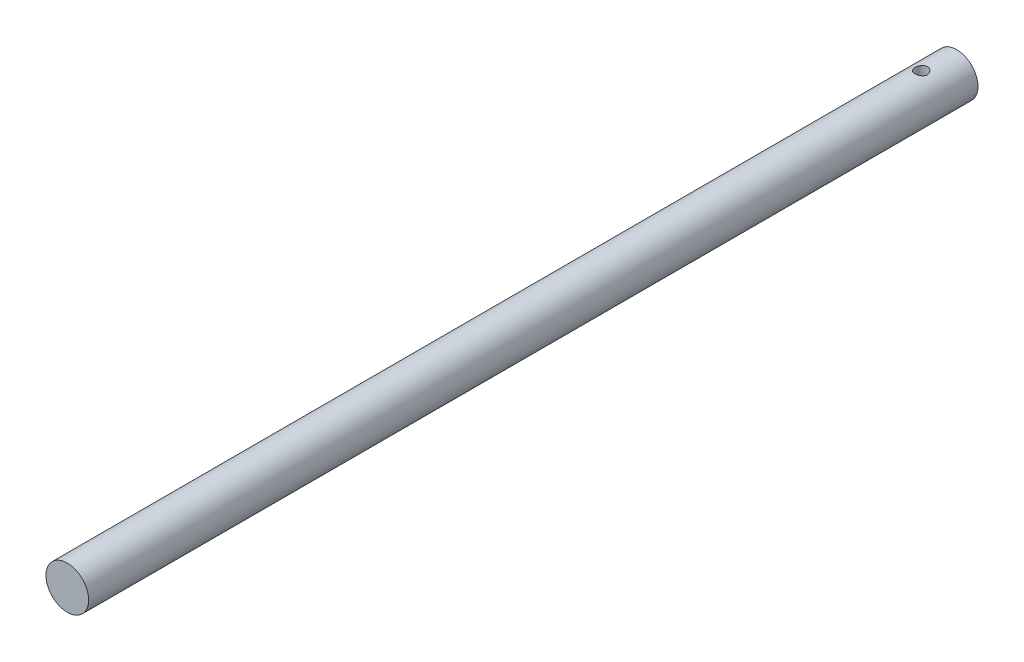
ISO-10303-21;
HEADER;
FILE_DESCRIPTION(('STEP AP214'),'2;1');
FILE_NAME('part.step','',(''),(''),'','','');
FILE_SCHEMA(('AUTOMOTIVE_DESIGN { 1 0 10303 214 1 1 1 1 }'));
ENDSEC;
DATA;
#1=APPLICATION_CONTEXT('core data for automotive mechanical design processes');
#2=APPLICATION_PROTOCOL_DEFINITION('international standard','automotive_design',2000,#1);
#3=PRODUCT_CONTEXT('',#1,'mechanical');
#4=PRODUCT('Part','Part','',(#3));
#5=PRODUCT_RELATED_PRODUCT_CATEGORY('part','',(#4));
#6=PRODUCT_DEFINITION_FORMATION('','',#4);
#7=PRODUCT_DEFINITION_CONTEXT('part definition',#1,'design');
#8=PRODUCT_DEFINITION('design','',#6,#7);
#9=PRODUCT_DEFINITION_SHAPE('','',#8);
#10=(LENGTH_UNIT() NAMED_UNIT(*) SI_UNIT(.MILLI.,.METRE.));
#11=(NAMED_UNIT(*) PLANE_ANGLE_UNIT() SI_UNIT($,.RADIAN.));
#12=(NAMED_UNIT(*) SI_UNIT($,.STERADIAN.) SOLID_ANGLE_UNIT());
#13=UNCERTAINTY_MEASURE_WITH_UNIT(LENGTH_MEASURE(1.E-05),#10,'distance_accuracy_value','');
#14=(GEOMETRIC_REPRESENTATION_CONTEXT(3) GLOBAL_UNCERTAINTY_ASSIGNED_CONTEXT((#13)) GLOBAL_UNIT_ASSIGNED_CONTEXT((#10,
#11,#12)) REPRESENTATION_CONTEXT('',''));
#15=CARTESIAN_POINT('',(0.,0.,0.));
#16=DIRECTION('',(0.,0.,1.));
#17=DIRECTION('',(1.,0.,0.));
#18=AXIS2_PLACEMENT_3D('',#15,#16,#17);
#19=CARTESIAN_POINT('',(0.,0.,250.));
#20=DIRECTION('',(0.,0.,-1.));
#21=DIRECTION('',(-1.,0.,0.));
#22=AXIS2_PLACEMENT_3D('',#19,#20,#21);
#23=CYLINDRICAL_SURFACE('',#22,6.);
#24=CARTESIAN_POINT('',(0.,-6.,11.75));
#25=CARTESIAN_POINT('',(0.0961253080181366,-5.99999897932778,11.749998515148));
#26=CARTESIAN_POINT('',(0.192265738977877,-5.99766772555916,11.7420535900183));
#27=CARTESIAN_POINT('',(0.381754666118447,-5.9885952693758,11.7105542039317));
#28=CARTESIAN_POINT('',(0.475102186570467,-5.98185254415878,11.6869943527991));
#29=CARTESIAN_POINT('',(0.656244329270385,-5.96469737869574,11.6251129938174));
#30=CARTESIAN_POINT('',(0.744046672462426,-5.95429017982355,11.5868125624894));
#31=CARTESIAN_POINT('',(0.911982923632399,-5.93089244308038,11.4966215584001));
#32=CARTESIAN_POINT('',(0.992115936834369,-5.91790160432062,11.4447294025335));
#33=CARTESIAN_POINT('',(1.14462561886912,-5.89033024399658,11.327334984187));
#34=CARTESIAN_POINT('',(1.2167633564312,-5.87571850769828,11.2615296641669));
#35=CARTESIAN_POINT('',(1.34915166645239,-5.84674198910841,11.1188232710068));
#36=CARTESIAN_POINT('',(1.40940036887666,-5.83237724599043,11.0419204556219));
#37=CARTESIAN_POINT('',(1.51753336674038,-5.80519383512121,10.8772103328606));
#38=CARTESIAN_POINT('',(1.56513041604445,-5.79241411758615,10.7892074182337));
#39=CARTESIAN_POINT('',(1.64475391362964,-5.7703123169837,10.6060139235983));
#40=CARTESIAN_POINT('',(1.67678387060039,-5.76098945488303,10.5108249688552));
#41=CARTESIAN_POINT('',(1.72351063083406,-5.74718144308774,10.3186353702977));
#42=CARTESIAN_POINT('',(1.73864609017391,-5.74257413524905,10.2217503825351));
#43=CARTESIAN_POINT('',(1.75252346344242,-5.73835505823415,10.0267152085859));
#44=CARTESIAN_POINT('',(1.75126910635539,-5.73874215273942,9.92856531526511));
#45=CARTESIAN_POINT('',(1.73274795276527,-5.74435959682319,9.73731524540825));
#46=CARTESIAN_POINT('',(1.7160256839307,-5.74942523520474,9.64415670470324));
#47=CARTESIAN_POINT('',(1.66792117497863,-5.76356324195848,9.46202918903925));
#48=CARTESIAN_POINT('',(1.63653755962284,-5.77263598619394,9.37306060796158));
#49=CARTESIAN_POINT('',(1.55958925270797,-5.79390080921967,9.20048400801911));
#50=CARTESIAN_POINT('',(1.51384428393234,-5.80613217077637,9.116961417586));
#51=CARTESIAN_POINT('',(1.40959719774949,-5.83231660479806,8.95859323240331));
#52=CARTESIAN_POINT('',(1.35109213587038,-5.84627007432716,8.8837496465045));
#53=CARTESIAN_POINT('',(1.22026040657199,-5.87499914138168,8.74176939696963));
#54=CARTESIAN_POINT('',(1.14748039837389,-5.88978548224527,8.67505196568478));
#55=CARTESIAN_POINT('',(0.991581308885601,-5.91802612754819,8.55467457984276));
#56=CARTESIAN_POINT('',(0.908461646345307,-5.93148035702561,8.50101535986281));
#57=CARTESIAN_POINT('',(0.733510271908773,-5.955652534232,8.40804165565273));
#58=CARTESIAN_POINT('',(0.641629012196375,-5.96635347926388,8.36881569218869));
#59=CARTESIAN_POINT('',(0.452189927913562,-5.98369087780733,8.30649482914881));
#60=CARTESIAN_POINT('',(0.354633604003036,-5.99032840050988,8.28339568596673));
#61=CARTESIAN_POINT('',(0.160181198028381,-5.99862388766847,8.25467172956898));
#62=CARTESIAN_POINT('',(0.0633758944645891,-6.00044382600874,8.24847829102018));
#63=CARTESIAN_POINT('',(-0.129894955210872,-5.99937180655025,8.25215387818972));
#64=CARTESIAN_POINT('',(-0.226360542441064,-5.99648044012062,8.26202088797948));
#65=CARTESIAN_POINT('',(-0.414097830664111,-5.98641640064662,8.29707558682437));
#66=CARTESIAN_POINT('',(-0.505436223327995,-5.97933553979801,8.32193493989793));
#67=CARTESIAN_POINT('',(-0.682629103921199,-5.96170716095043,8.38587721933104));
#68=CARTESIAN_POINT('',(-0.768482945307057,-5.95115923513568,8.42496181900248));
#69=CARTESIAN_POINT('',(-0.934392573124851,-5.92740206937566,8.51722533792297));
#70=CARTESIAN_POINT('',(-1.01427661269997,-5.91413878305625,8.57069881094937));
#71=CARTESIAN_POINT('',(-1.16413296084878,-5.8864769523799,8.68986114921517));
#72=CARTESIAN_POINT('',(-1.23410291257553,-5.87207813933966,8.75555291051717));
#73=CARTESIAN_POINT('',(-1.36462158583737,-5.84315282434342,8.8999553503897));
#74=CARTESIAN_POINT('',(-1.42476642228299,-5.82863878716344,8.97903434380822));
#75=CARTESIAN_POINT('',(-1.5309555158763,-5.80165389300297,9.14647697273483));
#76=CARTESIAN_POINT('',(-1.57700021873977,-5.78918297144387,9.23484031463907));
#77=CARTESIAN_POINT('',(-1.65335355571835,-5.76784149110914,9.41800906834096));
#78=CARTESIAN_POINT('',(-1.68374186549711,-5.75895275395434,9.51277902915982));
#79=CARTESIAN_POINT('',(-1.72804822085091,-5.74581531845761,9.70639550313222));
#80=CARTESIAN_POINT('',(-1.74197152209896,-5.7415651395094,9.8052407050269));
#81=CARTESIAN_POINT('',(-1.75260895170656,-5.73832630544296,10.0000225411818));
#82=CARTESIAN_POINT('',(-1.74997891215048,-5.73913712613566,10.0959205098643));
#83=CARTESIAN_POINT('',(-1.72913831847244,-5.74545008197209,10.285842892854));
#84=CARTESIAN_POINT('',(-1.71092832593949,-5.75095204802057,10.3798673745672));
#85=CARTESIAN_POINT('',(-1.65985748033916,-5.76589662443703,10.5623661830132));
#86=CARTESIAN_POINT('',(-1.62716125079618,-5.77529488178541,10.6508904754052));
#87=CARTESIAN_POINT('',(-1.54817363617336,-5.79696714255007,10.8212672461219));
#88=CARTESIAN_POINT('',(-1.50187976224371,-5.80924167234268,10.9031184995373));
#89=CARTESIAN_POINT('',(-1.39513128146528,-5.83581435741765,11.0608920702377));
#90=CARTESIAN_POINT('',(-1.33424162455882,-5.85016789019055,11.1365107175418));
#91=CARTESIAN_POINT('',(-1.20082452655383,-5.87900256664697,11.276669675805));
#92=CARTESIAN_POINT('',(-1.12829412203371,-5.89348374193531,11.3412071571145));
#93=CARTESIAN_POINT('',(-0.97128517460281,-5.92141239923087,11.4591095314771));
#94=CARTESIAN_POINT('',(-0.886536063614253,-5.93482122382387,11.51212417615));
#95=CARTESIAN_POINT('',(-0.708936452074231,-5.95864200095583,11.6030752495548));
#96=CARTESIAN_POINT('',(-0.61609014933606,-5.96905549446415,11.6410194352315));
#97=CARTESIAN_POINT('',(-0.436605177870391,-5.98468728404806,11.6969409493079));
#98=CARTESIAN_POINT('',(-0.350586197050688,-5.99038360588642,11.7167862705583));
#99=CARTESIAN_POINT('',(-0.176382174555845,-5.99804015775584,11.7433155106133));
#100=CARTESIAN_POINT('',(-0.0881974529296931,-6.00000093649312,11.7500013623901));
#101=CARTESIAN_POINT('',(0.,-6.,11.75));
#102=B_SPLINE_CURVE_WITH_KNOTS('',3,(#24,#25,#26,#27,#28,#29,#30,#31,#32,#33,#34,#35,#36,#37,
#38,#39,#40,#41,#42,#43,#44,#45,#46,#47,#48,#49,#50,#51,#52,#53,#54,#55,#56,#57,#58,#59,#60,#61,
#62,#63,#64,#65,#66,#67,#68,#69,#70,#71,#72,#73,#74,#75,#76,#77,#78,#79,#80,#81,#82,#83,#84,#85,
#86,#87,#88,#89,#90,#91,#92,#93,#94,#95,#96,#97,#98,#99,#100,#101),.UNSPECIFIED.,.T.,.F.,(4,2,2,
2,2,2,2,2,2,2,2,2,2,2,2,2,2,2,2,2,2,2,2,2,2,2,2,2,2,2,2,2,2,2,2,2,2,2,4),(0.,0.288052093618848,
0.576203672859809,0.863944765925737,1.15171938874705,1.4465642107671,1.74145537223886,
2.04255951405361,2.34359575805744,2.63661948180926,2.92957653844227,3.21259753810652,
3.49564509054993,3.78239825352144,4.06921765673404,4.36732499534254,4.6654490998204,
4.96537230276013,5.26521655422946,5.55484346037066,5.84443401496554,6.12790175562713,
6.41140285130437,6.70121883369904,6.99110359801335,7.29089914342066,7.59068521108749,
7.88893020644378,8.18707997551211,8.47349366019241,8.75989702134953,9.04312596000906,
9.32640677192025,9.61950228446207,9.9126725299444,10.2137891731667,10.5147506265854,
10.779084693066,11.0433799290662),.UNSPECIFIED.);
#103=CARTESIAN_POINT('',(0.,-6.,11.75));
#104=VERTEX_POINT('',#103);
#105=EDGE_CURVE('E41',#104,#104,#102,.T.);
#106=ORIENTED_EDGE('',*,*,#105,.T.);
#107=EDGE_LOOP('',(#106));
#108=FACE_BOUND('',#107,.T.);
#109=CARTESIAN_POINT('',(0.,6.,11.75));
#110=CARTESIAN_POINT('',(-0.0961253080181342,5.99999897932778,11.749998515148));
#111=CARTESIAN_POINT('',(-0.192265738977874,5.99766772555916,11.7420535900183));
#112=CARTESIAN_POINT('',(-0.381754666118444,5.9885952693758,11.7105542039317));
#113=CARTESIAN_POINT('',(-0.475102186570464,5.98185254415878,11.6869943527991));
#114=CARTESIAN_POINT('',(-0.656244329270382,5.96469737869574,11.6251129938174));
#115=CARTESIAN_POINT('',(-0.744046672462424,5.95429017982355,11.5868125624894));
#116=CARTESIAN_POINT('',(-0.911982923632396,5.93089244308038,11.4966215584001));
#117=CARTESIAN_POINT('',(-0.992115936834367,5.91790160432062,11.4447294025335));
#118=CARTESIAN_POINT('',(-1.14462561886912,5.89033024399658,11.327334984187));
#119=CARTESIAN_POINT('',(-1.21676335643119,5.87571850769828,11.2615296641669));
#120=CARTESIAN_POINT('',(-1.34915166645238,5.84674198910841,11.1188232710068));
#121=CARTESIAN_POINT('',(-1.40940036887666,5.83237724599043,11.0419204556219));
#122=CARTESIAN_POINT('',(-1.51753336674037,5.80519383512121,10.8772103328606));
#123=CARTESIAN_POINT('',(-1.56513041604445,5.79241411758615,10.7892074182337));
#124=CARTESIAN_POINT('',(-1.64475391362963,5.7703123169837,10.6060139235983));
#125=CARTESIAN_POINT('',(-1.67678387060038,5.76098945488303,10.5108249688552));
#126=CARTESIAN_POINT('',(-1.72351063083406,5.74718144308774,10.3186353702977));
#127=CARTESIAN_POINT('',(-1.73864609017391,5.74257413524905,10.2217503825351));
#128=CARTESIAN_POINT('',(-1.75252346344242,5.73835505823415,10.0267152085859));
#129=CARTESIAN_POINT('',(-1.75126910635538,5.73874215273942,9.92856531526511));
#130=CARTESIAN_POINT('',(-1.73274795276527,5.74435959682319,9.73731524540825));
#131=CARTESIAN_POINT('',(-1.71602568393069,5.74942523520474,9.64415670470324));
#132=CARTESIAN_POINT('',(-1.66792117497863,5.76356324195848,9.46202918903924));
#133=CARTESIAN_POINT('',(-1.63653755962284,5.77263598619395,9.37306060796158));
#134=CARTESIAN_POINT('',(-1.55958925270797,5.79390080921968,9.20048400801911));
#135=CARTESIAN_POINT('',(-1.51384428393233,5.80613217077637,9.116961417586));
#136=CARTESIAN_POINT('',(-1.40959719774949,5.83231660479806,8.95859323240331));
#137=CARTESIAN_POINT('',(-1.35109213587038,5.84627007432716,8.8837496465045));
#138=CARTESIAN_POINT('',(-1.22026040657199,5.87499914138168,8.74176939696963));
#139=CARTESIAN_POINT('',(-1.14748039837389,5.88978548224527,8.67505196568478));
#140=CARTESIAN_POINT('',(-0.991581308885599,5.91802612754819,8.55467457984276));
#141=CARTESIAN_POINT('',(-0.908461646345304,5.93148035702561,8.50101535986281));
#142=CARTESIAN_POINT('',(-0.73351027190877,5.955652534232,8.40804165565273));
#143=CARTESIAN_POINT('',(-0.641629012196371,5.96635347926388,8.36881569218869));
#144=CARTESIAN_POINT('',(-0.452189927913559,5.98369087780733,8.30649482914881));
#145=CARTESIAN_POINT('',(-0.354633604003033,5.99032840050988,8.28339568596673));
#146=CARTESIAN_POINT('',(-0.160181198028379,5.99862388766847,8.25467172956898));
#147=CARTESIAN_POINT('',(-0.0633758944645868,6.00044382600874,8.24847829102018));
#148=CARTESIAN_POINT('',(0.129894955210874,5.99937180655025,8.25215387818972));
#149=CARTESIAN_POINT('',(0.226360542441066,5.99648044012062,8.26202088797948));
#150=CARTESIAN_POINT('',(0.414097830664113,5.98641640064662,8.29707558682437));
#151=CARTESIAN_POINT('',(0.505436223327998,5.97933553979801,8.32193493989793));
#152=CARTESIAN_POINT('',(0.682629103921201,5.96170716095043,8.38587721933104));
#153=CARTESIAN_POINT('',(0.768482945307059,5.95115923513568,8.42496181900248));
#154=CARTESIAN_POINT('',(0.934392573124854,5.92740206937566,8.51722533792297));
#155=CARTESIAN_POINT('',(1.01427661269997,5.91413878305625,8.57069881094937));
#156=CARTESIAN_POINT('',(1.16413296084878,5.8864769523799,8.68986114921517));
#157=CARTESIAN_POINT('',(1.23410291257553,5.87207813933966,8.75555291051717));
#158=CARTESIAN_POINT('',(1.36462158583737,5.84315282434342,8.8999553503897));
#159=CARTESIAN_POINT('',(1.424766422283,5.82863878716343,8.97903434380822));
#160=CARTESIAN_POINT('',(1.5309555158763,5.80165389300297,9.14647697273483));
#161=CARTESIAN_POINT('',(1.57700021873978,5.78918297144387,9.23484031463907));
#162=CARTESIAN_POINT('',(1.65335355571835,5.76784149110914,9.41800906834096));
#163=CARTESIAN_POINT('',(1.68374186549711,5.75895275395434,9.51277902915982));
#164=CARTESIAN_POINT('',(1.72804822085091,5.74581531845761,9.70639550313222));
#165=CARTESIAN_POINT('',(1.74197152209896,5.7415651395094,9.80524070502689));
#166=CARTESIAN_POINT('',(1.75260895170656,5.73832630544296,10.0000225411818));
#167=CARTESIAN_POINT('',(1.74997891215049,5.73913712613566,10.0959205098643));
#168=CARTESIAN_POINT('',(1.72913831847244,5.74545008197209,10.285842892854));
#169=CARTESIAN_POINT('',(1.7109283259395,5.75095204802057,10.3798673745672));
#170=CARTESIAN_POINT('',(1.65985748033916,5.76589662443703,10.5623661830132));
#171=CARTESIAN_POINT('',(1.62716125079618,5.77529488178541,10.6508904754052));
#172=CARTESIAN_POINT('',(1.54817363617337,5.79696714255006,10.8212672461219));
#173=CARTESIAN_POINT('',(1.50187976224371,5.80924167234268,10.9031184995373));
#174=CARTESIAN_POINT('',(1.39513128146528,5.83581435741765,11.0608920702377));
#175=CARTESIAN_POINT('',(1.33424162455883,5.85016789019055,11.1365107175418));
#176=CARTESIAN_POINT('',(1.20082452655383,5.87900256664697,11.276669675805));
#177=CARTESIAN_POINT('',(1.12829412203371,5.89348374193531,11.3412071571145));
#178=CARTESIAN_POINT('',(0.971285174602813,5.92141239923087,11.4591095314771));
#179=CARTESIAN_POINT('',(0.886536063614256,5.93482122382386,11.51212417615));
#180=CARTESIAN_POINT('',(0.708936452074234,5.95864200095583,11.6030752495548));
#181=CARTESIAN_POINT('',(0.616090149336063,5.96905549446415,11.6410194352315));
#182=CARTESIAN_POINT('',(0.436605177870394,5.98468728404807,11.6969409493079));
#183=CARTESIAN_POINT('',(0.350586197050691,5.99038360588642,11.7167862705583));
#184=CARTESIAN_POINT('',(0.176382174555848,5.99804015775584,11.7433155106133));
#185=CARTESIAN_POINT('',(0.0881974529296956,6.00000093649312,11.7500013623901));
#186=CARTESIAN_POINT('',(0.,6.,11.75));
#187=B_SPLINE_CURVE_WITH_KNOTS('',3,(#109,#110,#111,#112,#113,#114,#115,#116,#117,#118,#119,
#120,#121,#122,#123,#124,#125,#126,#127,#128,#129,#130,#131,#132,#133,#134,#135,#136,#137,#138,
#139,#140,#141,#142,#143,#144,#145,#146,#147,#148,#149,#150,#151,#152,#153,#154,#155,#156,#157,
#158,#159,#160,#161,#162,#163,#164,#165,#166,#167,#168,#169,#170,#171,#172,#173,#174,#175,#176,
#177,#178,#179,#180,#181,#182,#183,#184,#185,#186),.UNSPECIFIED.,.T.,.F.,(4,2,2,2,2,2,2,2,2,2,2,
2,2,2,2,2,2,2,2,2,2,2,2,2,2,2,2,2,2,2,2,2,2,2,2,2,2,2,4),(0.,0.288052093618848,
0.576203672859809,0.863944765925738,1.15171938874705,1.4465642107671,1.74145537223886,
2.04255951405361,2.34359575805744,2.63661948180926,2.92957653844227,3.21259753810652,
3.49564509054993,3.78239825352144,4.06921765673404,4.36732499534254,4.6654490998204,
4.96537230276013,5.26521655422946,5.55484346037066,5.84443401496554,6.12790175562713,
6.41140285130437,6.70121883369904,6.99110359801335,7.29089914342066,7.59068521108749,
7.88893020644378,8.18707997551211,8.47349366019241,8.75989702134953,9.04312596000906,
9.32640677192025,9.61950228446207,9.9126725299444,10.2137891731667,10.5147506265854,
10.779084693066,11.0433799290662),.UNSPECIFIED.);
#188=CARTESIAN_POINT('',(0.,6.,11.75));
#189=VERTEX_POINT('',#188);
#190=EDGE_CURVE('E57',#189,#189,#187,.T.);
#191=ORIENTED_EDGE('',*,*,#190,.T.);
#192=EDGE_LOOP('',(#191));
#193=FACE_BOUND('',#192,.T.);
#194=CARTESIAN_POINT('',(0.,0.,250.));
#195=DIRECTION('',(0.,0.,1.));
#196=DIRECTION('',(1.,0.,0.));
#197=AXIS2_PLACEMENT_3D('',#194,#195,#196);
#198=CIRCLE('',#197,6.);
#199=CARTESIAN_POINT('',(6.,0.,250.));
#200=VERTEX_POINT('',#199);
#201=EDGE_CURVE('E10',#200,#200,#198,.T.);
#202=ORIENTED_EDGE('',*,*,#201,.F.);
#203=EDGE_LOOP('',(#202));
#204=FACE_BOUND('',#203,.T.);
#205=CARTESIAN_POINT('',(0.,0.,0.));
#206=DIRECTION('',(0.,0.,1.));
#207=DIRECTION('',(1.,0.,0.));
#208=AXIS2_PLACEMENT_3D('',#205,#206,#207);
#209=CIRCLE('',#208,6.);
#210=CARTESIAN_POINT('',(6.,0.,0.));
#211=VERTEX_POINT('',#210);
#212=EDGE_CURVE('E50',#211,#211,#209,.T.);
#213=ORIENTED_EDGE('',*,*,#212,.T.);
#214=EDGE_LOOP('',(#213));
#215=FACE_BOUND('',#214,.T.);
#216=ADVANCED_FACE('F37',(#108,#193,#204,#215),#23,.T.);
#217=CARTESIAN_POINT('',(0.,0.,250.));
#218=DIRECTION('',(0.,0.,1.));
#219=DIRECTION('',(1.,0.,0.));
#220=AXIS2_PLACEMENT_3D('',#217,#218,#219);
#221=PLANE('',#220);
#222=ORIENTED_EDGE('',*,*,#201,.T.);
#223=EDGE_LOOP('',(#222));
#224=FACE_BOUND('',#223,.T.);
#225=ADVANCED_FACE('F69',(#224),#221,.T.);
#226=CARTESIAN_POINT('',(0.,0.,0.));
#227=DIRECTION('',(0.,0.,1.));
#228=DIRECTION('',(1.,0.,0.));
#229=AXIS2_PLACEMENT_3D('',#226,#227,#228);
#230=PLANE('',#229);
#231=ORIENTED_EDGE('',*,*,#212,.F.);
#232=EDGE_LOOP('',(#231));
#233=FACE_BOUND('',#232,.T.);
#234=ADVANCED_FACE('F67',(#233),#230,.F.);
#235=CARTESIAN_POINT('',(0.,-18.,10.));
#236=DIRECTION('',(0.,1.,0.));
#237=DIRECTION('',(0.,0.,1.));
#238=AXIS2_PLACEMENT_3D('',#235,#236,#237);
#239=CYLINDRICAL_SURFACE('',#238,1.75);
#240=ORIENTED_EDGE('',*,*,#190,.F.);
#241=EDGE_LOOP('',(#240));
#242=FACE_BOUND('',#241,.T.);
#243=ORIENTED_EDGE('',*,*,#105,.F.);
#244=EDGE_LOOP('',(#243));
#245=FACE_BOUND('',#244,.T.);
#246=ADVANCED_FACE('F63',(#242,#245),#239,.F.);
#247=CLOSED_SHELL('',(#216,#225,#234,#246));
#248=MANIFOLD_SOLID_BREP('B2',#247);
#249=ADVANCED_BREP_SHAPE_REPRESENTATION('',(#18,#248),#14);
#250=SHAPE_DEFINITION_REPRESENTATION(#9,#249);
ENDSEC;
END-ISO-10303-21;
